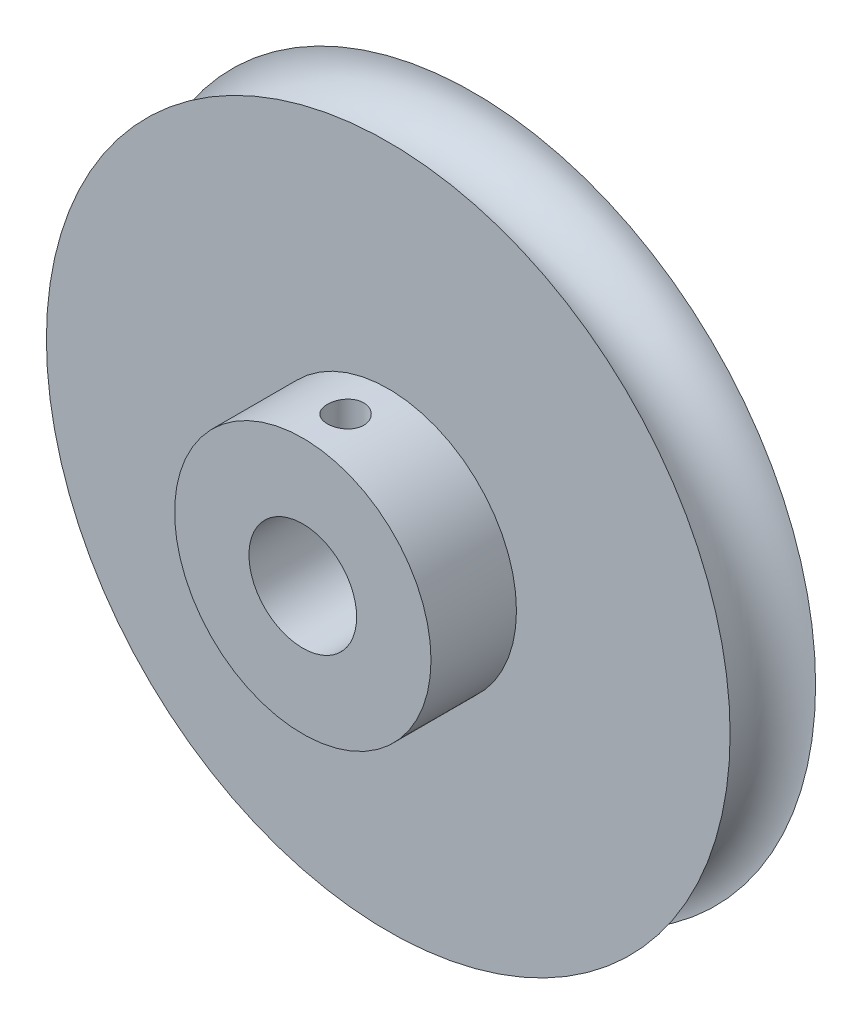
ISO-10303-21;
HEADER;
FILE_DESCRIPTION(('STEP AP214'),'2;1');
FILE_NAME('part.step','',(''),(''),'','','');
FILE_SCHEMA(('AUTOMOTIVE_DESIGN { 1 0 10303 214 1 1 1 1 }'));
ENDSEC;
DATA;
#1=APPLICATION_CONTEXT('core data for automotive mechanical design processes');
#2=APPLICATION_PROTOCOL_DEFINITION('international standard','automotive_design',2000,#1);
#3=PRODUCT_CONTEXT('',#1,'mechanical');
#4=PRODUCT('Part','Part','',(#3));
#5=PRODUCT_RELATED_PRODUCT_CATEGORY('part','',(#4));
#6=PRODUCT_DEFINITION_FORMATION('','',#4);
#7=PRODUCT_DEFINITION_CONTEXT('part definition',#1,'design');
#8=PRODUCT_DEFINITION('design','',#6,#7);
#9=PRODUCT_DEFINITION_SHAPE('','',#8);
#10=(LENGTH_UNIT() NAMED_UNIT(*) SI_UNIT(.MILLI.,.METRE.));
#11=(NAMED_UNIT(*) PLANE_ANGLE_UNIT() SI_UNIT($,.RADIAN.));
#12=(NAMED_UNIT(*) SI_UNIT($,.STERADIAN.) SOLID_ANGLE_UNIT());
#13=UNCERTAINTY_MEASURE_WITH_UNIT(LENGTH_MEASURE(1.E-05),#10,'distance_accuracy_value','');
#14=(GEOMETRIC_REPRESENTATION_CONTEXT(3) GLOBAL_UNCERTAINTY_ASSIGNED_CONTEXT((#13)) GLOBAL_UNIT_ASSIGNED_CONTEXT((#10,
#11,#12)) REPRESENTATION_CONTEXT('',''));
#15=CARTESIAN_POINT('',(0.,0.,0.));
#16=DIRECTION('',(0.,0.,1.));
#17=DIRECTION('',(1.,0.,0.));
#18=AXIS2_PLACEMENT_3D('',#15,#16,#17);
#19=CARTESIAN_POINT('',(0.,0.,6.35));
#20=DIRECTION('',(0.,0.,1.));
#21=DIRECTION('',(1.,0.,0.));
#22=AXIS2_PLACEMENT_3D('',#19,#20,#21);
#23=PLANE('',#22);
#24=CARTESIAN_POINT('',(0.,0.,6.35));
#25=DIRECTION('',(0.,0.,-1.));
#26=DIRECTION('',(-1.,0.,0.));
#27=AXIS2_PLACEMENT_3D('',#24,#25,#26);
#28=CIRCLE('',#27,25.4);
#29=CARTESIAN_POINT('',(-25.4,0.,6.35));
#30=VERTEX_POINT('',#29);
#31=EDGE_CURVE('E51',#30,#30,#28,.T.);
#32=ORIENTED_EDGE('',*,*,#31,.F.);
#33=EDGE_LOOP('',(#32));
#34=FACE_BOUND('',#33,.T.);
#35=CARTESIAN_POINT('',(0.,0.,6.35));
#36=DIRECTION('',(0.,0.,1.));
#37=DIRECTION('',(1.,0.,0.));
#38=AXIS2_PLACEMENT_3D('',#35,#36,#37);
#39=CIRCLE('',#38,9.525);
#40=CARTESIAN_POINT('',(9.525,0.,6.35));
#41=VERTEX_POINT('',#40);
#42=EDGE_CURVE('E39',#41,#41,#39,.T.);
#43=ORIENTED_EDGE('',*,*,#42,.F.);
#44=EDGE_LOOP('',(#43));
#45=FACE_BOUND('',#44,.T.);
#46=ADVANCED_FACE('F35',(#34,#45),#23,.T.);
#47=CARTESIAN_POINT('',(0.,0.,0.));
#48=DIRECTION('',(0.,0.,1.));
#49=DIRECTION('',(1.,0.,0.));
#50=AXIS2_PLACEMENT_3D('',#47,#48,#49);
#51=PLANE('',#50);
#52=CARTESIAN_POINT('',(0.,0.,0.));
#53=DIRECTION('',(0.,0.,1.));
#54=DIRECTION('',(1.,0.,0.));
#55=AXIS2_PLACEMENT_3D('',#52,#53,#54);
#56=CIRCLE('',#55,4.);
#57=CARTESIAN_POINT('',(4.,0.,0.));
#58=VERTEX_POINT('',#57);
#59=EDGE_CURVE('E46',#58,#58,#56,.T.);
#60=ORIENTED_EDGE('',*,*,#59,.T.);
#61=EDGE_LOOP('',(#60));
#62=FACE_BOUND('',#61,.T.);
#63=CARTESIAN_POINT('',(0.,0.,0.));
#64=DIRECTION('',(0.,0.,-1.));
#65=DIRECTION('',(-1.,0.,0.));
#66=AXIS2_PLACEMENT_3D('',#63,#64,#65);
#67=CIRCLE('',#66,25.4);
#68=CARTESIAN_POINT('',(-25.4,0.,0.));
#69=VERTEX_POINT('',#68);
#70=EDGE_CURVE('E56',#69,#69,#67,.T.);
#71=ORIENTED_EDGE('',*,*,#70,.T.);
#72=EDGE_LOOP('',(#71));
#73=FACE_BOUND('',#72,.T.);
#74=ADVANCED_FACE('F37',(#62,#73),#51,.F.);
#75=CARTESIAN_POINT('',(0.,0.,12.7));
#76=DIRECTION('',(0.,0.,-1.));
#77=DIRECTION('',(-1.,0.,0.));
#78=AXIS2_PLACEMENT_3D('',#75,#76,#77);
#79=CYLINDRICAL_SURFACE('',#78,9.525);
#80=CARTESIAN_POINT('',(0.,9.525,10.87755));
#81=CARTESIAN_POINT('',(-0.0755655976816572,9.52499883544133,10.8775468494992));
#82=CARTESIAN_POINT('',(-0.15117619052597,9.52409131330959,10.8711959695634));
#83=CARTESIAN_POINT('',(-0.300287151270771,9.52055835217433,10.8459648576033));
#84=CARTESIAN_POINT('',(-0.373785337552457,9.51793119936152,10.827072125918));
#85=CARTESIAN_POINT('',(-0.516491711234218,9.51125445786394,10.7773305032802));
#86=CARTESIAN_POINT('',(-0.585702978986119,9.50720590480422,10.7464903154966));
#87=CARTESIAN_POINT('',(-0.717956478880125,9.49813471345803,10.6737497625644));
#88=CARTESIAN_POINT('',(-0.780999633767499,9.49311222120842,10.6318510552407));
#89=CARTESIAN_POINT('',(-0.899582076386875,9.48261293824523,10.5378685832043));
#90=CARTESIAN_POINT('',(-0.955071714681261,9.47713349078531,10.4857224635403));
#91=CARTESIAN_POINT('',(-1.05654385783388,9.46635886923404,10.3728595220096));
#92=CARTESIAN_POINT('',(-1.10252583790297,9.46106370532788,10.3121422273553));
#93=CARTESIAN_POINT('',(-1.18386799219828,9.45123132571592,10.1835304084473));
#94=CARTESIAN_POINT('',(-1.21918062284904,9.44669754147111,10.1156055296265));
#95=CARTESIAN_POINT('',(-1.27787792823569,9.43893717382919,9.97471394175033));
#96=CARTESIAN_POINT('',(-1.30126318524386,9.43571052662166,9.90174747901318));
#97=CARTESIAN_POINT('',(-1.33528879327705,9.43095567694503,9.75336403034013));
#98=CARTESIAN_POINT('',(-1.34601378483648,9.4294161998728,9.6779668209943));
#99=CARTESIAN_POINT('',(-1.35467652647668,9.42817568923439,9.52642829692605));
#100=CARTESIAN_POINT('',(-1.35261493572031,9.42847456089922,9.45028702076316));
#101=CARTESIAN_POINT('',(-1.33583230696196,9.43086666465303,9.30001689861049));
#102=CARTESIAN_POINT('',(-1.32120518390171,9.43294658479556,9.22587732161757));
#103=CARTESIAN_POINT('',(-1.27985355102078,9.43864564973732,9.0811156343333));
#104=CARTESIAN_POINT('',(-1.25312873165563,9.44226483392165,9.01049361409722));
#105=CARTESIAN_POINT('',(-1.18824154515558,9.45064947664622,8.87448395940077));
#106=CARTESIAN_POINT('',(-1.15003904937553,9.45541894511602,8.80911572674019));
#107=CARTESIAN_POINT('',(-1.06330955919127,9.46556379734325,8.68568205263425));
#108=CARTESIAN_POINT('',(-1.01478195663337,9.4709392167827,8.62761704167278));
#109=CARTESIAN_POINT('',(-0.90826257270423,9.48174924277689,8.51989348495797));
#110=CARTESIAN_POINT('',(-0.850189975477845,9.48718394847766,8.47031482672299));
#111=CARTESIAN_POINT('',(-0.726505462258721,9.49745540808749,8.38159566039963));
#112=CARTESIAN_POINT('',(-0.660893519149158,9.50229215984575,8.34245518985604));
#113=CARTESIAN_POINT('',(-0.523926144520027,9.510827057161,8.2757207261379));
#114=CARTESIAN_POINT('',(-0.452567864494437,9.51452463358219,8.24813250204029));
#115=CARTESIAN_POINT('',(-0.306167109608615,9.52035969074385,8.20535305564064));
#116=CARTESIAN_POINT('',(-0.231124858029964,9.52249726591004,8.19016108299608));
#117=CARTESIAN_POINT('',(-0.0801762432820882,9.52495904880413,8.17271069914379));
#118=CARTESIAN_POINT('',(-0.00428282720717793,9.52529866502681,8.17034238526622));
#119=CARTESIAN_POINT('',(0.146817931365051,9.524168092447,8.17831540129666));
#120=CARTESIAN_POINT('',(0.222025292779436,9.52269795369903,8.18865637968874));
#121=CARTESIAN_POINT('',(0.369289102936129,9.51812259988871,8.22166307218494));
#122=CARTESIAN_POINT('',(0.44135770398496,9.51502443886738,8.24427562863008));
#123=CARTESIAN_POINT('',(0.580680471889356,9.50753947792815,8.30112780163864));
#124=CARTESIAN_POINT('',(0.647934433140914,9.50315262301874,8.33536791438614));
#125=CARTESIAN_POINT('',(0.77620467591947,9.4935399324895,8.41476381715234));
#126=CARTESIAN_POINT('',(0.837177109643446,9.48830877815843,8.459989791168));
#127=CARTESIAN_POINT('',(0.950705597809332,9.47760737233701,8.55997537305969));
#128=CARTESIAN_POINT('',(1.00326121608461,9.47213710847449,8.61473547469573));
#129=CARTESIAN_POINT('',(1.09886074844703,9.46152559761601,8.73272243685143));
#130=CARTESIAN_POINT('',(1.14183126178115,9.45638709032373,8.79600905404925));
#131=CARTESIAN_POINT('',(1.21653167244332,9.44706826250527,8.92896631202911));
#132=CARTESIAN_POINT('',(1.24826184804492,9.44288791825905,8.99863679471402));
#133=CARTESIAN_POINT('',(1.29946538400745,9.43597820043692,9.14215914417313));
#134=CARTESIAN_POINT('',(1.31897830322261,9.43324414834836,9.21599666272677));
#135=CARTESIAN_POINT('',(1.345319873266,9.42952381500997,9.36594219078185));
#136=CARTESIAN_POINT('',(1.35214930172846,9.42853742660975,9.44205006079564));
#137=CARTESIAN_POINT('',(1.35291295863125,9.42842781645573,9.59364477184617));
#138=CARTESIAN_POINT('',(1.3469625577439,9.42928792530812,9.66913104519324));
#139=CARTESIAN_POINT('',(1.32258170781638,9.43273830266146,9.81801815612782));
#140=CARTESIAN_POINT('',(1.30415127083787,9.43532856949026,9.89141899573078));
#141=CARTESIAN_POINT('',(1.2553727524624,9.44194180469148,10.0340253403766));
#142=CARTESIAN_POINT('',(1.22503189411436,9.44596390459443,10.1032333588379));
#143=CARTESIAN_POINT('',(1.15330518427279,9.4549887896295,10.2355950826549));
#144=CARTESIAN_POINT('',(1.11191903769159,9.45999160096152,10.2987486261971));
#145=CARTESIAN_POINT('',(1.0188542556852,9.47046811950877,10.4177961838886));
#146=CARTESIAN_POINT('',(0.967089958379283,9.47594551475005,10.4736229145383));
#147=CARTESIAN_POINT('',(0.854918991877807,9.48672263564786,10.5758393619756));
#148=CARTESIAN_POINT('',(0.794510308164767,9.49202231953358,10.6222268728947));
#149=CARTESIAN_POINT('',(0.666418723372221,9.50187634373476,10.7044488902564));
#150=CARTESIAN_POINT('',(0.598701562632703,9.50642689669676,10.7402304638056));
#151=CARTESIAN_POINT('',(0.458188163554138,9.51423250698025,10.7998599233095));
#152=CARTESIAN_POINT('',(0.385397366468363,9.51748892782062,10.8237203764087));
#153=CARTESIAN_POINT('',(0.260218618427356,9.52158178385422,10.8533151979636));
#154=CARTESIAN_POINT('',(0.208609408177632,9.52285714774573,10.8623896450464));
#155=CARTESIAN_POINT('',(0.104673991252838,9.52456665474621,10.8745081054538));
#156=CARTESIAN_POINT('',(0.0523477921596508,9.52500080674378,10.8775521824979));
#157=CARTESIAN_POINT('',(0.,9.525,10.87755));
#158=B_SPLINE_CURVE_WITH_KNOTS('',3,(#80,#81,#82,#83,#84,#85,#86,#87,#88,#89,#90,#91,#92,#93,
#94,#95,#96,#97,#98,#99,#100,#101,#102,#103,#104,#105,#106,#107,#108,#109,#110,#111,#112,#113,
#114,#115,#116,#117,#118,#119,#120,#121,#122,#123,#124,#125,#126,#127,#128,#129,#130,#131,#132,
#133,#134,#135,#136,#137,#138,#139,#140,#141,#142,#143,#144,#145,#146,#147,#148,#149,#150,#151,
#152,#153,#154,#155,#156,#157),.UNSPECIFIED.,.T.,.F.,(4,2,2,2,2,2,2,2,2,2,2,2,2,2,2,2,2,2,2,2,2,
2,2,2,2,2,2,2,2,2,2,2,2,2,2,2,2,2,4),(0.,0.226505534516146,0.453237152194009,0.679803916009259,
0.906336733606786,1.13429323762301,1.36226232067594,1.59123276029142,1.82019202092431,
2.04761173950495,2.27501973443763,2.50074272143518,2.72647148434654,2.95299881797859,
3.17953949787361,3.40810768093214,3.6366766861094,3.86535970063488,4.09402887199793,
4.32073513997944,4.54743513781857,4.773160871875,4.99889623956284,5.22611352323024,
5.45334257768582,5.68225613463762,5.9111640240519,6.13932683533275,6.36747565732027,
6.59357351465535,6.81967115347264,7.04563188717623,7.27159865828695,7.49951363567906,
7.72748181392154,7.95656930197468,8.1854147756606,8.34232731650324,8.49923819933399),.UNSPECIFIED.);
#159=CARTESIAN_POINT('',(0.,9.525,10.87755));
#160=VERTEX_POINT('',#159);
#161=EDGE_CURVE('E59',#160,#160,#158,.T.);
#162=ORIENTED_EDGE('',*,*,#161,.T.);
#163=EDGE_LOOP('',(#162));
#164=FACE_BOUND('',#163,.T.);
#165=CARTESIAN_POINT('',(0.,0.,12.7));
#166=DIRECTION('',(0.,0.,1.));
#167=DIRECTION('',(1.,0.,0.));
#168=AXIS2_PLACEMENT_3D('',#165,#166,#167);
#169=CIRCLE('',#168,9.525);
#170=CARTESIAN_POINT('',(9.525,0.,12.7));
#171=VERTEX_POINT('',#170);
#172=EDGE_CURVE('E10',#171,#171,#169,.T.);
#173=ORIENTED_EDGE('',*,*,#172,.F.);
#174=EDGE_LOOP('',(#173));
#175=FACE_BOUND('',#174,.T.);
#176=ORIENTED_EDGE('',*,*,#42,.T.);
#177=EDGE_LOOP('',(#176));
#178=FACE_BOUND('',#177,.T.);
#179=ADVANCED_FACE('F70',(#164,#175,#178),#79,.T.);
#180=CARTESIAN_POINT('',(0.,0.,12.7));
#181=DIRECTION('',(0.,0.,1.));
#182=DIRECTION('',(1.,0.,0.));
#183=AXIS2_PLACEMENT_3D('',#180,#181,#182);
#184=PLANE('',#183);
#185=CARTESIAN_POINT('',(0.,0.,12.7));
#186=DIRECTION('',(0.,0.,1.));
#187=DIRECTION('',(1.,0.,0.));
#188=AXIS2_PLACEMENT_3D('',#185,#186,#187);
#189=CIRCLE('',#188,4.);
#190=CARTESIAN_POINT('',(4.,0.,12.7));
#191=VERTEX_POINT('',#190);
#192=EDGE_CURVE('E48',#191,#191,#189,.T.);
#193=ORIENTED_EDGE('',*,*,#192,.F.);
#194=EDGE_LOOP('',(#193));
#195=FACE_BOUND('',#194,.T.);
#196=ORIENTED_EDGE('',*,*,#172,.T.);
#197=EDGE_LOOP('',(#196));
#198=FACE_BOUND('',#197,.T.);
#199=ADVANCED_FACE('F86',(#195,#198),#184,.T.);
#200=CARTESIAN_POINT('',(0.,0.,0.));
#201=DIRECTION('',(0.,0.,1.));
#202=DIRECTION('',(1.,0.,0.));
#203=AXIS2_PLACEMENT_3D('',#200,#201,#202);
#204=CYLINDRICAL_SURFACE('',#203,4.);
#205=CARTESIAN_POINT('',(0.,4.,10.87755));
#206=CARTESIAN_POINT('',(0.073739050961815,4.0000003652744,10.87755056006));
#207=CARTESIAN_POINT('',(0.147474310927834,3.9979422676283,10.8715002378604));
#208=CARTESIAN_POINT('',(0.292769357385455,3.98993514213324,10.8475354536769));
#209=CARTESIAN_POINT('',(0.364328979769019,3.98398582152813,10.8296200990261));
#210=CARTESIAN_POINT('',(0.503157126306698,3.96884184238156,10.7826121062771));
#211=CARTESIAN_POINT('',(0.5704327225468,3.95965270522232,10.7535384769907));
#212=CARTESIAN_POINT('',(0.699152411861923,3.93896448953899,10.6851263378668));
#213=CARTESIAN_POINT('',(0.760595299451355,3.92746493502911,10.6457857123512));
#214=CARTESIAN_POINT('',(0.878087591662695,3.90290684204576,10.5564897810976));
#215=CARTESIAN_POINT('',(0.933901351542572,3.88981017965103,10.5062349725342));
#216=CARTESIAN_POINT('',(1.03648991777588,3.86374115173317,10.397173848154));
#217=CARTESIAN_POINT('',(1.08326265549071,3.85076881530034,10.3383655806372));
#218=CARTESIAN_POINT('',(1.16780306583326,3.82599515792021,10.2117257361367));
#219=CARTESIAN_POINT('',(1.20526152944493,3.81424014143166,10.143677806151));
#220=CARTESIAN_POINT('',(1.2681013612762,3.793813224202,10.0017864898527));
#221=CARTESIAN_POINT('',(1.29348653752226,3.78514035154269,9.92794493947356));
#222=CARTESIAN_POINT('',(1.33057003933591,3.77226179997908,9.77924635412494));
#223=CARTESIAN_POINT('',(1.34271089853046,3.76791214685453,9.70451252606679));
#224=CARTESIAN_POINT('',(1.35434465925973,3.76374712025534,9.55395169315452));
#225=CARTESIAN_POINT('',(1.35384160460853,3.76393029707729,9.47812504556309));
#226=CARTESIAN_POINT('',(1.34054483005336,3.76868428428414,9.3313337611442));
#227=CARTESIAN_POINT('',(1.328332391851,3.77304757543275,9.26030857478512));
#228=CARTESIAN_POINT('',(1.2929131751287,3.78533000773349,9.121381850226));
#229=CARTESIAN_POINT('',(1.26970504439217,3.79324958622069,9.05348069733709));
#230=CARTESIAN_POINT('',(1.21257969567349,3.81189752199325,8.92142399978095));
#231=CARTESIAN_POINT('',(1.17849266093028,3.82266992332552,8.85734840398384));
#232=CARTESIAN_POINT('',(1.10069502115956,3.84579168954526,8.73564455357941));
#233=CARTESIAN_POINT('',(1.05698157221814,3.85814151999593,8.67801821186709));
#234=CARTESIAN_POINT('',(0.95839476749853,3.88383915451425,8.56758739983186));
#235=CARTESIAN_POINT('',(0.903047375464344,3.89720489555063,8.51520941408974));
#236=CARTESIAN_POINT('',(0.784190835217094,3.92284799554659,8.42036555047655));
#237=CARTESIAN_POINT('',(0.720680859092588,3.9351252438892,8.37790067930122));
#238=CARTESIAN_POINT('',(0.586377478003397,3.95737745603798,8.30373171963862));
#239=CARTESIAN_POINT('',(0.51551479238758,3.96732697545626,8.2721449225686));
#240=CARTESIAN_POINT('',(0.369064286005885,3.98361761388868,8.22147367635713));
#241=CARTESIAN_POINT('',(0.293478166996245,3.98996002424621,8.20238475261223));
#242=CARTESIAN_POINT('',(0.143334606318402,3.99810645778428,8.17801369278033));
#243=CARTESIAN_POINT('',(0.0688808146920494,4.00009970292712,8.17215549388713));
#244=CARTESIAN_POINT('',(-0.0799626683313226,3.99989262166952,8.17276720531911));
#245=CARTESIAN_POINT('',(-0.154352368641956,3.9976930264654,8.17923496609985));
#246=CARTESIAN_POINT('',(-0.298630325753248,3.98947237211125,8.20386093786743));
#247=CARTESIAN_POINT('',(-0.368586673962152,3.98356782182736,8.22166296475717));
#248=CARTESIAN_POINT('',(-0.504489462163019,3.96864809967418,8.26800423049516));
#249=CARTESIAN_POINT('',(-0.570435386895214,3.95963252908952,8.29654484566742));
#250=CARTESIAN_POINT('',(-0.698410294101012,3.93910368260847,8.36439669099171));
#251=CARTESIAN_POINT('',(-0.760287564381754,3.92753011320834,8.40397529645741));
#252=CARTESIAN_POINT('',(-0.87670817669218,3.9031943071523,8.49246695977094));
#253=CARTESIAN_POINT('',(-0.931249212732046,3.89043169887101,8.54138294099124));
#254=CARTESIAN_POINT('',(-1.03410865095365,3.86439742013857,8.64986854702729));
#255=CARTESIAN_POINT('',(-1.08201607624762,3.85112989689448,8.70982978528195));
#256=CARTESIAN_POINT('',(-1.16714306738321,3.82619275797566,8.83722339044417));
#257=CARTESIAN_POINT('',(-1.20436246945168,3.81452316678755,8.90465587181204));
#258=CARTESIAN_POINT('',(-1.26690207526013,3.79421204563183,9.04515433486791));
#259=CARTESIAN_POINT('',(-1.29223999157418,3.78556601315449,9.11821174056244));
#260=CARTESIAN_POINT('',(-1.33013343190279,3.77242033377096,9.26791805866598));
#261=CARTESIAN_POINT('',(-1.34269493711504,3.76791874676199,9.34456527293252));
#262=CARTESIAN_POINT('',(-1.35420428715988,3.76379652207792,9.49491853348414));
#263=CARTESIAN_POINT('',(-1.35383624769369,3.76393060026203,9.56856605318321));
#264=CARTESIAN_POINT('',(-1.34118827642512,3.76845566270461,9.71469093920702));
#265=CARTESIAN_POINT('',(-1.32890909347553,3.7728463793485,9.78716837880338));
#266=CARTESIAN_POINT('',(-1.29327749830683,3.78520481653253,9.92744091757961));
#267=CARTESIAN_POINT('',(-1.27015285741646,3.7930987880036,9.9953008866313));
#268=CARTESIAN_POINT('',(-1.21367284791613,3.81154517911969,10.1262288034879));
#269=CARTESIAN_POINT('',(-1.18031516760581,3.82209819936225,10.1892956644821));
#270=CARTESIAN_POINT('',(-1.10257812997165,3.845261248929,10.3119018622708));
#271=CARTESIAN_POINT('',(-1.0577729746199,3.85794211029656,10.3711577553996));
#272=CARTESIAN_POINT('',(-0.959125818306256,3.88364165900639,10.4815305899626));
#273=CARTESIAN_POINT('',(-0.905281227791769,3.89666044224806,10.5326451909375));
#274=CARTESIAN_POINT('',(-0.787463330671123,3.92220271600919,10.6273763000315));
#275=CARTESIAN_POINT('',(-0.723167865506799,3.93468472207405,10.6706047612854));
#276=CARTESIAN_POINT('',(-0.587808236572528,3.95716814430872,10.7455963441516));
#277=CARTESIAN_POINT('',(-0.516745575892189,3.96717010956017,10.7773620043413));
#278=CARTESIAN_POINT('',(-0.372423161492997,3.98326295233837,10.8274280997187));
#279=CARTESIAN_POINT('',(-0.299328134068118,3.98947881260907,10.8461621200266));
#280=CARTESIAN_POINT('',(-0.15082028694891,3.99784654720756,10.8712209441973));
#281=CARTESIAN_POINT('',(-0.0754081611948118,3.99999962645748,10.8775494272628));
#282=CARTESIAN_POINT('',(0.,4.,10.87755));
#283=B_SPLINE_CURVE_WITH_KNOTS('',3,(#205,#206,#207,#208,#209,#210,#211,#212,#213,#214,#215,
#216,#217,#218,#219,#220,#221,#222,#223,#224,#225,#226,#227,#228,#229,#230,#231,#232,#233,#234,
#235,#236,#237,#238,#239,#240,#241,#242,#243,#244,#245,#246,#247,#248,#249,#250,#251,#252,#253,
#254,#255,#256,#257,#258,#259,#260,#261,#262,#263,#264,#265,#266,#267,#268,#269,#270,#271,#272,
#273,#274,#275,#276,#277,#278,#279,#280,#281,#282),.UNSPECIFIED.,.T.,.F.,(4,2,2,2,2,2,2,2,2,2,2,
2,2,2,2,2,2,2,2,2,2,2,2,2,2,2,2,2,2,2,2,2,2,2,2,2,2,2,4),(0.,0.220939581068785,
0.441895786439387,0.662477238152888,0.88310418013091,1.11079439594426,1.33853664709934,
1.57305252102399,1.80749437733888,2.03383714603689,2.26010752603994,2.47569718163394,
2.69131335666791,2.91047495342985,3.12970138376854,3.3607276034257,3.59177727404101,
3.82524545926202,4.058630010282,4.28163932601376,4.50460975434197,4.72089753822001,
4.93721305232835,5.15930761136237,5.38147181878623,5.61403918754246,5.84661011975027,
6.07883323098321,6.31094757829824,6.53079998026519,6.7506385610225,6.96605385334918,
7.18151784506629,7.4066072008356,7.63176114896825,7.86604414860135,8.10027523151229,
8.32628289926542,8.55222352809417),.UNSPECIFIED.);
#284=CARTESIAN_POINT('',(0.,4.,10.87755));
#285=VERTEX_POINT('',#284);
#286=EDGE_CURVE('E66',#285,#285,#283,.T.);
#287=ORIENTED_EDGE('',*,*,#286,.T.);
#288=EDGE_LOOP('',(#287));
#289=FACE_BOUND('',#288,.T.);
#290=ORIENTED_EDGE('',*,*,#59,.F.);
#291=EDGE_LOOP('',(#290));
#292=FACE_BOUND('',#291,.T.);
#293=ORIENTED_EDGE('',*,*,#192,.T.);
#294=EDGE_LOOP('',(#293));
#295=FACE_BOUND('',#294,.T.);
#296=ADVANCED_FACE('F83',(#289,#292,#295),#204,.F.);
#297=CARTESIAN_POINT('',(0.,0.,3.175));
#298=DIRECTION('',(0.,0.,-1.));
#299=DIRECTION('',(-1.,0.,0.));
#300=AXIS2_PLACEMENT_3D('',#297,#298,#299);
#301=TOROIDAL_SURFACE('',#300,25.4,3.175);
#302=ORIENTED_EDGE('',*,*,#31,.T.);
#303=EDGE_LOOP('',(#302));
#304=FACE_BOUND('',#303,.T.);
#305=ORIENTED_EDGE('',*,*,#70,.F.);
#306=EDGE_LOOP('',(#305));
#307=FACE_BOUND('',#306,.T.);
#308=ADVANCED_FACE('F76',(#304,#307),#301,.F.);
#309=CARTESIAN_POINT('',(0.,9.525,9.525));
#310=DIRECTION('',(0.,1.,0.));
#311=DIRECTION('',(0.,0.,1.));
#312=AXIS2_PLACEMENT_3D('',#309,#310,#311);
#313=CYLINDRICAL_SURFACE('',#312,1.35254999999999);
#314=ORIENTED_EDGE('',*,*,#286,.F.);
#315=EDGE_LOOP('',(#314));
#316=FACE_BOUND('',#315,.T.);
#317=ORIENTED_EDGE('',*,*,#161,.F.);
#318=EDGE_LOOP('',(#317));
#319=FACE_BOUND('',#318,.T.);
#320=ADVANCED_FACE('F73',(#316,#319),#313,.F.);
#321=CLOSED_SHELL('',(#46,#74,#179,#199,#296,#308,#320));
#322=MANIFOLD_SOLID_BREP('B2',#321);
#323=ADVANCED_BREP_SHAPE_REPRESENTATION('',(#18,#322),#14);
#324=SHAPE_DEFINITION_REPRESENTATION(#9,#323);
ENDSEC;
END-ISO-10303-21;
